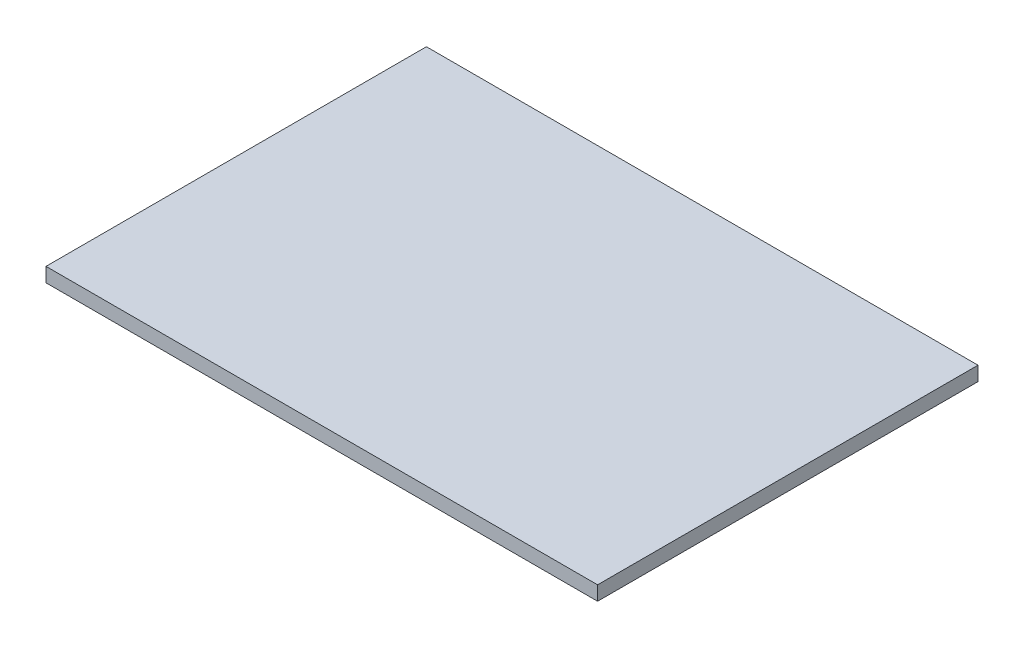
ISO-10303-21;
HEADER;
FILE_DESCRIPTION(('STEP AP214'),'2;1');
FILE_NAME('part.step','',(''),(''),'','','');
FILE_SCHEMA(('AUTOMOTIVE_DESIGN { 1 0 10303 214 1 1 1 1 }'));
ENDSEC;
DATA;
#1=APPLICATION_CONTEXT('core data for automotive mechanical design processes');
#2=APPLICATION_PROTOCOL_DEFINITION('international standard','automotive_design',2000,#1);
#3=PRODUCT_CONTEXT('',#1,'mechanical');
#4=PRODUCT('Part','Part','',(#3));
#5=PRODUCT_RELATED_PRODUCT_CATEGORY('part','',(#4));
#6=PRODUCT_DEFINITION_FORMATION('','',#4);
#7=PRODUCT_DEFINITION_CONTEXT('part definition',#1,'design');
#8=PRODUCT_DEFINITION('design','',#6,#7);
#9=PRODUCT_DEFINITION_SHAPE('','',#8);
#10=(LENGTH_UNIT() NAMED_UNIT(*) SI_UNIT(.MILLI.,.METRE.));
#11=(NAMED_UNIT(*) PLANE_ANGLE_UNIT() SI_UNIT($,.RADIAN.));
#12=(NAMED_UNIT(*) SI_UNIT($,.STERADIAN.) SOLID_ANGLE_UNIT());
#13=UNCERTAINTY_MEASURE_WITH_UNIT(LENGTH_MEASURE(1.E-05),#10,'distance_accuracy_value','');
#14=(GEOMETRIC_REPRESENTATION_CONTEXT(3) GLOBAL_UNCERTAINTY_ASSIGNED_CONTEXT((#13)) GLOBAL_UNIT_ASSIGNED_CONTEXT((#10,
#11,#12)) REPRESENTATION_CONTEXT('',''));
#15=CARTESIAN_POINT('',(0.,0.,0.));
#16=DIRECTION('',(0.,0.,1.));
#17=DIRECTION('',(1.,0.,0.));
#18=AXIS2_PLACEMENT_3D('',#15,#16,#17);
#19=CARTESIAN_POINT('',(-98.5616298546896,3.,-82.4002832232497));
#20=DIRECTION('',(1.,0.,0.));
#21=DIRECTION('',(0.,0.,-1.));
#22=AXIS2_PLACEMENT_3D('',#19,#20,#21);
#23=PLANE('',#22);
#24=DIRECTION('',(0.,0.,1.));
#25=VECTOR('',#24,1.);
#26=CARTESIAN_POINT('',(-98.5616298546896,0.,-82.4002832232497));
#27=LINE('',#26,#25);
#28=CARTESIAN_POINT('',(-98.5616298546896,0.,-82.4002832232497));
#29=VERTEX_POINT('',#28);
#30=CARTESIAN_POINT('',(-98.5616298546896,0.,-2.40028322324966));
#31=VERTEX_POINT('',#30);
#32=EDGE_CURVE('E96',#29,#31,#27,.T.);
#33=ORIENTED_EDGE('',*,*,#32,.T.);
#34=DIRECTION('',(0.,-1.,0.));
#35=VECTOR('',#34,1.);
#36=CARTESIAN_POINT('',(-98.5616298546896,3.,-2.40028322324966));
#37=LINE('',#36,#35);
#38=CARTESIAN_POINT('',(-98.5616298546896,3.,-2.40028322324966));
#39=VERTEX_POINT('',#38);
#40=EDGE_CURVE('E11',#39,#31,#37,.T.);
#41=ORIENTED_EDGE('',*,*,#40,.F.);
#42=DIRECTION('',(0.,0.,1.));
#43=VECTOR('',#42,1.);
#44=CARTESIAN_POINT('',(-98.5616298546896,3.,-82.4002832232497));
#45=LINE('',#44,#43);
#46=CARTESIAN_POINT('',(-98.5616298546896,3.,-82.4002832232497));
#47=VERTEX_POINT('',#46);
#48=EDGE_CURVE('E84',#47,#39,#45,.T.);
#49=ORIENTED_EDGE('',*,*,#48,.F.);
#50=DIRECTION('',(0.,-1.,0.));
#51=VECTOR('',#50,1.);
#52=CARTESIAN_POINT('',(-98.5616298546896,3.,-82.4002832232497));
#53=LINE('',#52,#51);
#54=EDGE_CURVE('E92',#47,#29,#53,.T.);
#55=ORIENTED_EDGE('',*,*,#54,.T.);
#56=EDGE_LOOP('',(#33,#41,#49,#55));
#57=FACE_BOUND('',#56,.T.);
#58=ADVANCED_FACE('F33',(#57),#23,.F.);
#59=CARTESIAN_POINT('',(-98.5616298546896,3.,-2.40028322324966));
#60=DIRECTION('',(0.,0.,-1.));
#61=DIRECTION('',(-1.,0.,0.));
#62=AXIS2_PLACEMENT_3D('',#59,#60,#61);
#63=PLANE('',#62);
#64=DIRECTION('',(1.,0.,0.));
#65=VECTOR('',#64,1.);
#66=CARTESIAN_POINT('',(-98.5616298546896,0.,-2.40028322324966));
#67=LINE('',#66,#65);
#68=CARTESIAN_POINT('',(17.4383701453104,0.,-2.40028322324966));
#69=VERTEX_POINT('',#68);
#70=EDGE_CURVE('E88',#31,#69,#67,.T.);
#71=ORIENTED_EDGE('',*,*,#70,.T.);
#72=DIRECTION('',(0.,-1.,0.));
#73=VECTOR('',#72,1.);
#74=CARTESIAN_POINT('',(17.4383701453104,3.,-2.40028322324966));
#75=LINE('',#74,#73);
#76=CARTESIAN_POINT('',(17.4383701453104,3.,-2.40028322324966));
#77=VERTEX_POINT('',#76);
#78=EDGE_CURVE('E41',#77,#69,#75,.T.);
#79=ORIENTED_EDGE('',*,*,#78,.F.);
#80=DIRECTION('',(1.,0.,0.));
#81=VECTOR('',#80,1.);
#82=CARTESIAN_POINT('',(-98.5616298546896,3.,-2.40028322324966));
#83=LINE('',#82,#81);
#84=EDGE_CURVE('E79',#39,#77,#83,.T.);
#85=ORIENTED_EDGE('',*,*,#84,.F.);
#86=ORIENTED_EDGE('',*,*,#40,.T.);
#87=EDGE_LOOP('',(#71,#79,#85,#86));
#88=FACE_BOUND('',#87,.T.);
#89=ADVANCED_FACE('F87',(#88),#63,.F.);
#90=CARTESIAN_POINT('',(17.4383701453104,3.,-82.4002832232497));
#91=DIRECTION('',(-1.,0.,0.));
#92=DIRECTION('',(0.,0.,1.));
#93=AXIS2_PLACEMENT_3D('',#90,#91,#92);
#94=PLANE('',#93);
#95=DIRECTION('',(0.,0.,-1.));
#96=VECTOR('',#95,1.);
#97=CARTESIAN_POINT('',(17.4383701453104,0.,-82.4002832232497));
#98=LINE('',#97,#96);
#99=CARTESIAN_POINT('',(17.4383701453104,0.,-82.4002832232497));
#100=VERTEX_POINT('',#99);
#101=EDGE_CURVE('E66',#69,#100,#98,.T.);
#102=ORIENTED_EDGE('',*,*,#101,.T.);
#103=DIRECTION('',(0.,-1.,0.));
#104=VECTOR('',#103,1.);
#105=CARTESIAN_POINT('',(17.4383701453104,3.,-82.4002832232497));
#106=LINE('',#105,#104);
#107=CARTESIAN_POINT('',(17.4383701453104,3.,-82.4002832232497));
#108=VERTEX_POINT('',#107);
#109=EDGE_CURVE('E89',#108,#100,#106,.T.);
#110=ORIENTED_EDGE('',*,*,#109,.F.);
#111=DIRECTION('',(0.,0.,-1.));
#112=VECTOR('',#111,1.);
#113=CARTESIAN_POINT('',(17.4383701453104,3.,-82.4002832232497));
#114=LINE('',#113,#112);
#115=EDGE_CURVE('E82',#77,#108,#114,.T.);
#116=ORIENTED_EDGE('',*,*,#115,.F.);
#117=ORIENTED_EDGE('',*,*,#78,.T.);
#118=EDGE_LOOP('',(#102,#110,#116,#117));
#119=FACE_BOUND('',#118,.T.);
#120=ADVANCED_FACE('F90',(#119),#94,.F.);
#121=CARTESIAN_POINT('',(-98.5616298546896,3.,-82.4002832232497));
#122=DIRECTION('',(0.,0.,1.));
#123=DIRECTION('',(1.,0.,0.));
#124=AXIS2_PLACEMENT_3D('',#121,#122,#123);
#125=PLANE('',#124);
#126=DIRECTION('',(-1.,0.,0.));
#127=VECTOR('',#126,1.);
#128=CARTESIAN_POINT('',(-98.5616298546896,0.,-82.4002832232497));
#129=LINE('',#128,#127);
#130=EDGE_CURVE('E72',#100,#29,#129,.T.);
#131=ORIENTED_EDGE('',*,*,#130,.T.);
#132=ORIENTED_EDGE('',*,*,#54,.F.);
#133=DIRECTION('',(-1.,0.,0.));
#134=VECTOR('',#133,1.);
#135=CARTESIAN_POINT('',(-98.5616298546896,3.,-82.4002832232497));
#136=LINE('',#135,#134);
#137=EDGE_CURVE('E49',#108,#47,#136,.T.);
#138=ORIENTED_EDGE('',*,*,#137,.F.);
#139=ORIENTED_EDGE('',*,*,#109,.T.);
#140=EDGE_LOOP('',(#131,#132,#138,#139));
#141=FACE_BOUND('',#140,.T.);
#142=ADVANCED_FACE('F103',(#141),#125,.F.);
#143=CARTESIAN_POINT('',(0.,3.,0.));
#144=DIRECTION('',(0.,1.,0.));
#145=DIRECTION('',(0.,0.,1.));
#146=AXIS2_PLACEMENT_3D('',#143,#144,#145);
#147=PLANE('',#146);
#148=ORIENTED_EDGE('',*,*,#48,.T.);
#149=ORIENTED_EDGE('',*,*,#84,.T.);
#150=ORIENTED_EDGE('',*,*,#115,.T.);
#151=ORIENTED_EDGE('',*,*,#137,.T.);
#152=EDGE_LOOP('',(#148,#149,#150,#151));
#153=FACE_BOUND('',#152,.T.);
#154=ADVANCED_FACE('F80',(#153),#147,.T.);
#155=CARTESIAN_POINT('',(0.,0.,0.));
#156=DIRECTION('',(0.,1.,0.));
#157=DIRECTION('',(0.,0.,1.));
#158=AXIS2_PLACEMENT_3D('',#155,#156,#157);
#159=PLANE('',#158);
#160=ORIENTED_EDGE('',*,*,#32,.F.);
#161=ORIENTED_EDGE('',*,*,#130,.F.);
#162=ORIENTED_EDGE('',*,*,#101,.F.);
#163=ORIENTED_EDGE('',*,*,#70,.F.);
#164=EDGE_LOOP('',(#160,#161,#162,#163));
#165=FACE_BOUND('',#164,.T.);
#166=ADVANCED_FACE('F106',(#165),#159,.F.);
#167=CLOSED_SHELL('',(#58,#89,#120,#142,#154,#166));
#168=MANIFOLD_SOLID_BREP('B2',#167);
#169=ADVANCED_BREP_SHAPE_REPRESENTATION('',(#18,#168),#14);
#170=SHAPE_DEFINITION_REPRESENTATION(#9,#169);
ENDSEC;
END-ISO-10303-21;
